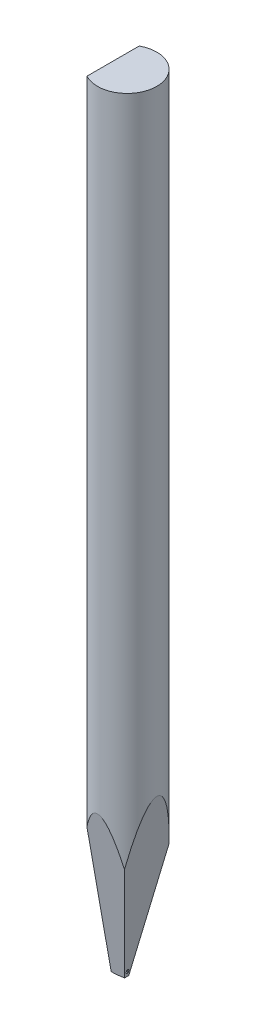
ISO-10303-21;
HEADER;
FILE_DESCRIPTION(('STEP AP214'),'2;1');
FILE_NAME('part.step','',(''),(''),'','','');
FILE_SCHEMA(('AUTOMOTIVE_DESIGN { 1 0 10303 214 1 1 1 1 }'));
ENDSEC;
DATA;
#1=APPLICATION_CONTEXT('core data for automotive mechanical design processes');
#2=APPLICATION_PROTOCOL_DEFINITION('international standard','automotive_design',2000,#1);
#3=PRODUCT_CONTEXT('',#1,'mechanical');
#4=PRODUCT('Part','Part','',(#3));
#5=PRODUCT_RELATED_PRODUCT_CATEGORY('part','',(#4));
#6=PRODUCT_DEFINITION_FORMATION('','',#4);
#7=PRODUCT_DEFINITION_CONTEXT('part definition',#1,'design');
#8=PRODUCT_DEFINITION('design','',#6,#7);
#9=PRODUCT_DEFINITION_SHAPE('','',#8);
#10=(LENGTH_UNIT() NAMED_UNIT(*) SI_UNIT(.MILLI.,.METRE.));
#11=(NAMED_UNIT(*) PLANE_ANGLE_UNIT() SI_UNIT($,.RADIAN.));
#12=(NAMED_UNIT(*) SI_UNIT($,.STERADIAN.) SOLID_ANGLE_UNIT());
#13=UNCERTAINTY_MEASURE_WITH_UNIT(LENGTH_MEASURE(1.E-05),#10,'distance_accuracy_value','');
#14=(GEOMETRIC_REPRESENTATION_CONTEXT(3) GLOBAL_UNCERTAINTY_ASSIGNED_CONTEXT((#13)) GLOBAL_UNIT_ASSIGNED_CONTEXT((#10,
#11,#12)) REPRESENTATION_CONTEXT('',''));
#15=CARTESIAN_POINT('',(0.,0.,0.));
#16=DIRECTION('',(0.,0.,1.));
#17=DIRECTION('',(1.,0.,0.));
#18=AXIS2_PLACEMENT_3D('',#15,#16,#17);
#19=CARTESIAN_POINT('',(-0.27432,0.,27.2760283406468));
#20=DIRECTION('',(-0.139173100960066,0.99026806874157,0.));
#21=DIRECTION('',(-0.99026806874157,-0.139173100960066,0.));
#22=AXIS2_PLACEMENT_3D('',#19,#20,#21);
#23=PLANE('',#22);
#24=DIRECTION('',(-0.99026806874157,-0.139173100960066,0.));
#25=VECTOR('',#24,1.);
#26=CARTESIAN_POINT('',(-0.27432,0.,0.0253999999999983));
#27=LINE('',#26,#25);
#28=CARTESIAN_POINT('',(-0.145800064,0.018062299081338,0.0253999999999992));
#29=VERTEX_POINT('',#28);
#30=CARTESIAN_POINT('',(-0.254691435266474,0.00275861487165983,0.0254));
#31=VERTEX_POINT('',#30);
#32=EDGE_CURVE('E186',#29,#31,#27,.T.);
#33=ORIENTED_EDGE('',*,*,#32,.F.);
#34=DIRECTION('',(0.,0.,1.));
#35=VECTOR('',#34,1.);
#36=CARTESIAN_POINT('',(-0.145800064,0.018062299081338,27.2760283406468));
#37=LINE('',#36,#35);
#38=CARTESIAN_POINT('',(-0.145800064,0.018062299081338,-0.0253999999999992));
#39=VERTEX_POINT('',#38);
#40=EDGE_CURVE('E11',#39,#29,#37,.T.);
#41=ORIENTED_EDGE('',*,*,#40,.F.);
#42=DIRECTION('',(-0.99026806874157,-0.139173100960066,0.));
#43=VECTOR('',#42,1.);
#44=CARTESIAN_POINT('',(-0.27432,0.,-0.0253999999999983));
#45=LINE('',#44,#43);
#46=CARTESIAN_POINT('',(-0.254691435266474,0.00275861487165983,-0.0254));
#47=VERTEX_POINT('',#46);
#48=EDGE_CURVE('E183',#39,#47,#45,.T.);
#49=ORIENTED_EDGE('',*,*,#48,.T.);
#50=CARTESIAN_POINT('',(-2.43404817183527,-0.30353,0.));
#51=DIRECTION('',(-0.139173100960066,0.99026806874157,0.));
#52=DIRECTION('',(-0.99026806874157,-0.139173100960066,0.));
#53=AXIS2_PLACEMENT_3D('',#50,#51,#52);
#54=ELLIPSE('',#53,2.20832903686027,0.30734);
#55=CARTESIAN_POINT('',(-0.274320000000002,0.,-0.0482432865795852));
#56=VERTEX_POINT('',#55);
#57=EDGE_CURVE('E192',#47,#56,#54,.T.);
#58=ORIENTED_EDGE('',*,*,#57,.T.);
#59=DIRECTION('',(0.,0.,-1.));
#60=VECTOR('',#59,1.);
#61=CARTESIAN_POINT('',(-0.27432,0.,27.2760283406468));
#62=LINE('',#61,#60);
#63=CARTESIAN_POINT('',(-0.274319999999996,0.,-0.0508000000000001));
#64=VERTEX_POINT('',#63);
#65=EDGE_CURVE('E210',#56,#64,#62,.T.);
#66=ORIENTED_EDGE('',*,*,#65,.T.);
#67=DIRECTION('',(0.98997002855162,0.139131214142995,-0.0245325869121374));
#68=VECTOR('',#67,1.);
#69=CARTESIAN_POINT('',(26.3320118858664,3.73927609160853,-0.710135263268685));
#70=LINE('',#69,#68);
#71=CARTESIAN_POINT('',(-0.0138656438636779,0.0366044726132731,-0.0572543561363243));
#72=VERTEX_POINT('',#71);
#73=EDGE_CURVE('E252',#64,#72,#70,.T.);
#74=ORIENTED_EDGE('',*,*,#73,.T.);
#75=DIRECTION('',(0.,0.,-1.));
#76=VECTOR('',#75,1.);
#77=CARTESIAN_POINT('',(-0.0138656438636759,0.036604472613273,27.2760283406468));
#78=LINE('',#77,#76);
#79=CARTESIAN_POINT('',(-0.0138656438636779,0.0366044726132731,0.0572543561363243));
#80=VERTEX_POINT('',#79);
#81=EDGE_CURVE('E207',#80,#72,#78,.T.);
#82=ORIENTED_EDGE('',*,*,#81,.F.);
#83=DIRECTION('',(-0.98997002855162,-0.139131214142995,-0.0245325869121374));
#84=VECTOR('',#83,1.);
#85=CARTESIAN_POINT('',(26.3320118858664,3.73927609160853,0.710135263268685));
#86=LINE('',#85,#84);
#87=CARTESIAN_POINT('',(-0.274319999999996,0.,0.0508000000000001));
#88=VERTEX_POINT('',#87);
#89=EDGE_CURVE('E220',#80,#88,#86,.T.);
#90=ORIENTED_EDGE('',*,*,#89,.T.);
#91=CARTESIAN_POINT('',(-0.274320000000002,0.,0.0482432865795852));
#92=VERTEX_POINT('',#91);
#93=EDGE_CURVE('E211',#88,#92,#62,.T.);
#94=ORIENTED_EDGE('',*,*,#93,.T.);
#95=EDGE_CURVE('E194',#92,#31,#54,.T.);
#96=ORIENTED_EDGE('',*,*,#95,.T.);
#97=EDGE_LOOP('',(#33,#41,#49,#58,#66,#74,#82,#90,#94,#96));
#98=FACE_BOUND('',#97,.T.);
#99=ADVANCED_FACE('F43',(#98),#23,.F.);
#100=CARTESIAN_POINT('',(26.8421219491216,-0.30353,0.));
#101=DIRECTION('',(-1.,0.,0.));
#102=DIRECTION('',(0.,0.,1.));
#103=AXIS2_PLACEMENT_3D('',#100,#101,#102);
#104=CYLINDRICAL_SURFACE('',#103,0.30734);
#105=DIRECTION('',(-1.,0.,0.));
#106=VECTOR('',#105,1.);
#107=CARTESIAN_POINT('',(26.8421219491216,0.00275861487165983,0.0254));
#108=LINE('',#107,#106);
#109=CARTESIAN_POINT('',(-0.277017052873613,0.0027586148716614,0.0254));
#110=VERTEX_POINT('',#109);
#111=EDGE_CURVE('E51',#31,#110,#108,.T.);
#112=ORIENTED_EDGE('',*,*,#111,.F.);
#113=ORIENTED_EDGE('',*,*,#95,.F.);
#114=DIRECTION('',(-1.,0.,0.));
#115=VECTOR('',#114,1.);
#116=CARTESIAN_POINT('',(26.8421219491216,0.,0.0482432865795852));
#117=LINE('',#116,#115);
#118=CARTESIAN_POINT('',(-0.35052,0.,0.0482432865795794));
#119=VERTEX_POINT('',#118);
#120=EDGE_CURVE('E66',#92,#119,#117,.T.);
#121=ORIENTED_EDGE('',*,*,#120,.T.);
#122=CARTESIAN_POINT('',(-0.35052,0.,-0.0482432865795922));
#123=CARTESIAN_POINT('',(-0.350767913301095,-1.1954284377854E-07,-0.048243986655547));
#124=CARTESIAN_POINT('',(-0.351014861392933,3.62470794983104E-06,-0.048220483758382));
#125=CARTESIAN_POINT('',(-0.351497824475881,1.77257610530524E-05,-0.0481316635507885));
#126=CARTESIAN_POINT('',(-0.351733938449228,2.79980345508149E-05,-0.0480668807295797));
#127=CARTESIAN_POINT('',(-0.352256326088675,5.7700596975821E-05,-0.0478789541586123));
#128=CARTESIAN_POINT('',(-0.352538394385228,7.88787351782363E-05,-0.047744619946916));
#129=CARTESIAN_POINT('',(-0.353078295346922,0.000127703558985957,-0.0474331108524054));
#130=CARTESIAN_POINT('',(-0.353335984553504,0.000155385552449555,-0.0472557019452803));
#131=CARTESIAN_POINT('',(-0.35400174233734,0.000236174594357564,-0.0467343071530911));
#132=CARTESIAN_POINT('',(-0.354386489991853,0.000293366747035748,-0.04636155839518));
#133=CARTESIAN_POINT('',(-0.355098951579075,0.000413574680164979,-0.0455669319559005));
#134=CARTESIAN_POINT('',(-0.355426537167256,0.000476603091413922,-0.0451449471799635));
#135=CARTESIAN_POINT('',(-0.356612086855197,0.000724574718518985,-0.0434579803018282));
#136=CARTESIAN_POINT('',(-0.357318341338529,0.000917424822642262,-0.0420900984298431));
#137=CARTESIAN_POINT('',(-0.358546499103956,0.00129385703696158,-0.0392733364497363));
#138=CARTESIAN_POINT('',(-0.359067131306758,0.00147736813627271,-0.0378239736930998));
#139=CARTESIAN_POINT('',(-0.361082963556257,0.00223677886764565,-0.0314441024489371));
#140=CARTESIAN_POINT('',(-0.361998491462296,0.00272303861932417,-0.0263250556700667));
#141=CARTESIAN_POINT('',(-0.363287466260709,0.00343648568054139,-0.0160225561821167));
#142=CARTESIAN_POINT('',(-0.363659578270333,0.00366303472730859,-0.0108389763128923));
#143=CARTESIAN_POINT('',(-0.363972985043323,0.0038533013861436,-0.000449493392455334));
#144=CARTESIAN_POINT('',(-0.363914353724791,0.00381706409391488,0.0047564056754146));
#145=CARTESIAN_POINT('',(-0.363359645903478,0.00348101396992449,0.0151346555748685));
#146=CARTESIAN_POINT('',(-0.362863906204432,0.00318140407435992,0.0203070291482927));
#147=CARTESIAN_POINT('',(-0.361587863461912,0.00253284401461593,0.0281196828661384));
#148=CARTESIAN_POINT('',(-0.361052170464872,0.00227386598671672,0.0308032472057591));
#149=CARTESIAN_POINT('',(-0.359879874536833,0.00178202258087566,0.035298540975975));
#150=CARTESIAN_POINT('',(-0.359320212463204,0.00156415994286525,0.037132976562585));
#151=CARTESIAN_POINT('',(-0.357915449615094,0.00108653420359277,0.0408693960879644));
#152=CARTESIAN_POINT('',(-0.357051905851088,0.000824845821214569,0.0427659366927868));
#153=CARTESIAN_POINT('',(-0.355666955135468,0.000526022910361374,0.0448100132221754));
#154=CARTESIAN_POINT('',(-0.355427139387405,0.000477218188451427,0.0451397061499284));
#155=CARTESIAN_POINT('',(-0.354916645564496,0.000382020953423657,0.0457761949331294));
#156=CARTESIAN_POINT('',(-0.35464590420184,0.00033563368038394,0.0460829416292439));
#157=CARTESIAN_POINT('',(-0.354064289185938,0.000246758191852077,0.0466652445212367));
#158=CARTESIAN_POINT('',(-0.353752942125968,0.000204328109507224,0.046940346423817));
#159=CARTESIAN_POINT('',(-0.353086480397466,0.000127793869629602,0.0474329155161212));
#160=CARTESIAN_POINT('',(-0.352731561443883,9.36543940548731E-05,0.0476506275388511));
#161=CARTESIAN_POINT('',(-0.352132978988947,5.02841505668838E-05,0.0479259603811172));
#162=CARTESIAN_POINT('',(-0.351903112512633,3.65754200280905E-05,0.0480126464944076));
#163=CARTESIAN_POINT('',(-0.351432234922693,1.53075235903079E-05,0.0481469291864223));
#164=CARTESIAN_POINT('',(-0.351191258260091,7.73054276190169E-06,0.0481946390090961));
#165=CARTESIAN_POINT('',(-0.350805892270718,1.19685939589671E-06,0.0482357533750448));
#166=CARTESIAN_POINT('',(-0.350662956582401,-3.31045745124852E-08,0.04824348277755));
#167=CARTESIAN_POINT('',(-0.350520000000001,0.,0.0482432865795857));
#168=B_SPLINE_CURVE_WITH_KNOTS('',3,(#122,#123,#124,#125,#126,#127,#128,#129,#130,#131,#132,
#133,#134,#135,#136,#137,#138,#139,#140,#141,#142,#143,#144,#145,#146,#147,#148,#149,#150,#151,
#152,#153,#154,#155,#156,#157,#158,#159,#160,#161,#162,#163,#164,#165,#166,#167),.UNSPECIFIED.,
.F.,.F.,(4,2,2,2,2,2,2,2,2,2,2,2,2,2,2,2,2,2,2,2,2,2,4),(0.,0.000741043318305509,
0.00147268140779471,0.00240682725086905,0.00334616655925005,0.00495326023235513,
0.00656391709747349,0.0111818210056003,0.0158307654682399,0.0313880221471919,0.0469834307890319,
0.0625761632290504,0.0781568915394562,0.0863865542979414,0.0921775559521106,0.0984081610415071,
0.0996385359492031,0.100871475463097,0.102120347956795,0.103363803055086,0.10409917629346,
0.104832405260402,0.105261095012052),.UNSPECIFIED.);
#169=CARTESIAN_POINT('',(-0.350519999999986,0.,-0.0482432865795852));
#170=VERTEX_POINT('',#169);
#171=EDGE_CURVE('E258',#170,#119,#168,.T.);
#172=ORIENTED_EDGE('',*,*,#171,.F.);
#173=DIRECTION('',(-1.,0.,0.));
#174=VECTOR('',#173,1.);
#175=CARTESIAN_POINT('',(26.8421219491216,0.,-0.0482432865795852));
#176=LINE('',#175,#174);
#177=EDGE_CURVE('E189',#56,#170,#176,.T.);
#178=ORIENTED_EDGE('',*,*,#177,.F.);
#179=ORIENTED_EDGE('',*,*,#57,.F.);
#180=DIRECTION('',(-1.,0.,0.));
#181=VECTOR('',#180,1.);
#182=CARTESIAN_POINT('',(26.8421219491216,0.00275861487165983,-0.0254));
#183=LINE('',#182,#181);
#184=CARTESIAN_POINT('',(-0.277017052873613,0.00275861487166104,-0.0254));
#185=VERTEX_POINT('',#184);
#186=EDGE_CURVE('E266',#47,#185,#183,.T.);
#187=ORIENTED_EDGE('',*,*,#186,.T.);
#188=CARTESIAN_POINT('',(-0.277017052873616,0.00275861487166319,-0.0254));
#189=CARTESIAN_POINT('',(-0.279164494405987,0.00275787671528144,-0.0253998771308303));
#190=CARTESIAN_POINT('',(-0.281317796028356,0.0027729853064504,-0.025226095347651));
#191=CARTESIAN_POINT('',(-0.285576223600568,0.00283121514116092,-0.0245140453953915));
#192=CARTESIAN_POINT('',(-0.287680955965897,0.00287451396608212,-0.0239734657049869));
#193=CARTESIAN_POINT('',(-0.291341514558487,0.00297415080728849,-0.0226581646183284));
#194=CARTESIAN_POINT('',(-0.292922287395721,0.00302608298732995,-0.021952874053652));
#195=CARTESIAN_POINT('',(-0.295944343791115,0.00314031874074114,-0.02029499673845));
#196=CARTESIAN_POINT('',(-0.297386025451601,0.00320259123656538,-0.019343146355838));
#197=CARTESIAN_POINT('',(-0.299856415426539,0.00332011935603143,-0.0173691432443147));
#198=CARTESIAN_POINT('',(-0.300914183310512,0.00337487582877375,-0.0163834060277842));
#199=CARTESIAN_POINT('',(-0.302853499386786,0.00348134304003134,-0.0142495600312396));
#200=CARTESIAN_POINT('',(-0.303735025277574,0.0035330533925099,-0.0131014307336146));
#201=CARTESIAN_POINT('',(-0.305284096014948,0.00362763657878566,-0.0106566504876344));
#202=CARTESIAN_POINT('',(-0.305950195024492,0.00367044903655595,-0.00935907216897071));
#203=CARTESIAN_POINT('',(-0.307020092293608,0.0037407949631982,-0.00665943953193492));
#204=CARTESIAN_POINT('',(-0.307424109068022,0.00376834115773853,-0.00525747333863388));
#205=CARTESIAN_POINT('',(-0.307911272474051,0.00380177700804997,-0.00257512047658988));
#206=CARTESIAN_POINT('',(-0.308027491080704,0.00380989467913993,-0.00130070779819402));
#207=CARTESIAN_POINT('',(-0.308030522738467,0.00381010307647606,0.00124816111540462));
#208=CARTESIAN_POINT('',(-0.307917423652917,0.00380219994111312,0.00252261714690251));
#209=CARTESIAN_POINT('',(-0.307481391057916,0.00377227202854999,0.00495889317186652));
#210=CARTESIAN_POINT('',(-0.30717085992914,0.00375108287767712,0.00612298167055997));
#211=CARTESIAN_POINT('',(-0.306366851611119,0.00369766813586477,0.00838554438941712));
#212=CARTESIAN_POINT('',(-0.305873360574227,0.0036654417095634,0.00948401363576132));
#213=CARTESIAN_POINT('',(-0.304700004775482,0.00359159572869644,0.0116366413861182));
#214=CARTESIAN_POINT('',(-0.304013120069097,0.00354963561612969,0.0126869416901592));
#215=CARTESIAN_POINT('',(-0.3024904948519,0.00346116467833486,0.0146727846946996));
#216=CARTESIAN_POINT('',(-0.301654697065106,0.00341465210522104,0.0156082830046177));
#217=CARTESIAN_POINT('',(-0.29975438753179,0.00331531896242703,0.0174580910740626));
#218=CARTESIAN_POINT('',(-0.298674483418413,0.00326240821162122,0.0183565395392823));
#219=CARTESIAN_POINT('',(-0.296397739190382,0.00316031129225176,0.0199899762242422));
#220=CARTESIAN_POINT('',(-0.295200842340051,0.00311112695154108,0.0207248845634118));
#221=CARTESIAN_POINT('',(-0.292512645688036,0.00301243060223673,0.0221404867419709));
#222=CARTESIAN_POINT('',(-0.291005645151681,0.00296424837308397,0.0227913928023832));
#223=CARTESIAN_POINT('',(-0.287914241115431,0.00288175486882889,0.0238748004063651));
#224=CARTESIAN_POINT('',(-0.286329773788391,0.00284745525547328,0.0243071184061138));
#225=CARTESIAN_POINT('',(-0.283455003528155,0.00280047332263064,0.0248914653993345));
#226=CARTESIAN_POINT('',(-0.282172577348956,0.00278476835336049,0.0250832300682597));
#227=CARTESIAN_POINT('',(-0.279599022116572,0.00276381915932513,0.0253372121777126));
#228=CARTESIAN_POINT('',(-0.278307935042222,0.00275854101258006,0.0253998497414433));
#229=CARTESIAN_POINT('',(-0.277017052875003,0.00275861487110465,0.0254000000067783));
#230=B_SPLINE_CURVE_WITH_KNOTS('',3,(#188,#189,#190,#191,#192,#193,#194,#195,#196,#197,#198,
#199,#200,#201,#202,#203,#204,#205,#206,#207,#208,#209,#210,#211,#212,#213,#214,#215,#216,#217,
#218,#219,#220,#221,#222,#223,#224,#225,#226,#227,#228,#229),.UNSPECIFIED.,.F.,.F.,(4,2,2,2,2,2,
2,2,2,2,2,2,2,2,2,2,2,2,2,2,4),(0.,0.006445082799109,0.0129311637490577,0.0181059616421331,
0.0232654793449091,0.0275885263307982,0.0319121200056629,0.0362641566953628,0.0406125601319723,
0.0444316470545822,0.0482492709661115,0.0518480159838001,0.0554470334345727,0.0591987706886129,
0.0629519540893279,0.067153184421551,0.0713564623468411,0.07626502081946,0.0811776940895098,
0.0850616737339214,0.088932996532078),.UNSPECIFIED.);
#231=EDGE_CURVE('E281',#185,#110,#230,.T.);
#232=ORIENTED_EDGE('',*,*,#231,.T.);
#233=EDGE_LOOP('',(#112,#113,#121,#172,#178,#179,#187,#232));
#234=FACE_BOUND('',#233,.T.);
#235=ADVANCED_FACE('F271',(#234),#104,.F.);
#236=CARTESIAN_POINT('',(0.,0.,0.));
#237=DIRECTION('',(0.,1.,0.));
#238=DIRECTION('',(0.,0.,1.));
#239=AXIS2_PLACEMENT_3D('',#236,#237,#238);
#240=PLANE('',#239);
#241=ORIENTED_EDGE('',*,*,#120,.F.);
#242=ORIENTED_EDGE('',*,*,#93,.F.);
#243=DIRECTION('',(-1.,0.,0.));
#244=VECTOR('',#243,1.);
#245=CARTESIAN_POINT('',(26.8738719491216,0.,0.0508));
#246=LINE('',#245,#244);
#247=CARTESIAN_POINT('',(-0.35052,0.,0.0507999999999983));
#248=VERTEX_POINT('',#247);
#249=EDGE_CURVE('E223',#88,#248,#246,.T.);
#250=ORIENTED_EDGE('',*,*,#249,.T.);
#251=DIRECTION('',(0.,0.,-1.));
#252=VECTOR('',#251,1.);
#253=CARTESIAN_POINT('',(-0.35052,0.,26.4674719491216));
#254=LINE('',#253,#252);
#255=EDGE_CURVE('E198',#248,#119,#254,.T.);
#256=ORIENTED_EDGE('',*,*,#255,.T.);
#257=EDGE_LOOP('',(#241,#242,#250,#256));
#258=FACE_BOUND('',#257,.T.);
#259=ADVANCED_FACE('F275',(#258),#240,.F.);
#260=CARTESIAN_POINT('',(26.8738719491216,0.,0.0508));
#261=DIRECTION('',(0.,-0.173648177666931,0.984807753012208));
#262=DIRECTION('',(0.,-0.984807753012208,-0.173648177666931));
#263=AXIS2_PLACEMENT_3D('',#260,#261,#262);
#264=PLANE('',#263);
#265=CARTESIAN_POINT('',(-0.35052,0.0254,0.0552787053099933));
#266=DIRECTION('',(0.,-0.173648177666931,0.984807753012208));
#267=DIRECTION('',(0.,-0.984807753012208,-0.173648177666931));
#268=AXIS2_PLACEMENT_3D('',#265,#266,#267);
#269=ELLIPSE('',#268,0.0257918359418979,0.0254);
#270=CARTESIAN_POINT('',(-0.37592,0.0254,0.0552787053099933));
#271=VERTEX_POINT('',#270);
#272=EDGE_CURVE('E201',#248,#271,#269,.F.);
#273=ORIENTED_EDGE('',*,*,#272,.F.);
#274=ORIENTED_EDGE('',*,*,#249,.F.);
#275=ORIENTED_EDGE('',*,*,#89,.F.);
#276=DIRECTION('',(-0.171087869746036,-0.970287525247814,-0.171087869746036));
#277=VECTOR('',#276,1.);
#278=CARTESIAN_POINT('',(0.766901483986011,4.46455489014234,0.838021483986017));
#279=LINE('',#278,#277);
#280=CARTESIAN_POINT('',(0.523678555180163,3.08516911589156,0.594798555180167));
#281=VERTEX_POINT('',#280);
#282=EDGE_CURVE('E217',#281,#80,#279,.T.);
#283=ORIENTED_EDGE('',*,*,#282,.F.);
#284=CARTESIAN_POINT('',(0.,-0.288101116436578,0.));
#285=DIRECTION('',(0.,-0.173648177666931,0.984807753012208));
#286=DIRECTION('',(0.,-0.984807753012208,-0.173648177666931));
#287=AXIS2_PLACEMENT_3D('',#284,#285,#286);
#288=ELLIPSE('',#287,4.56371043248163,0.792479999999998);
#289=CARTESIAN_POINT('',(-0.37592,3.66844093071414,0.69764511322018));
#290=VERTEX_POINT('',#289);
#291=EDGE_CURVE('E229',#281,#290,#288,.T.);
#292=ORIENTED_EDGE('',*,*,#291,.T.);
#293=DIRECTION('',(0.,0.984807753012208,0.173648177666931));
#294=VECTOR('',#293,1.);
#295=CARTESIAN_POINT('',(-0.37592,20.2093857917021,3.6142599786234));
#296=LINE('',#295,#294);
#297=EDGE_CURVE('E244',#271,#290,#296,.T.);
#298=ORIENTED_EDGE('',*,*,#297,.F.);
#299=EDGE_LOOP('',(#273,#274,#275,#283,#292,#298));
#300=FACE_BOUND('',#299,.T.);
#301=ADVANCED_FACE('F307',(#300),#264,.T.);
#302=CARTESIAN_POINT('',(26.8738719491216,0.,-0.0508));
#303=DIRECTION('',(0.,-0.173648177666931,-0.984807753012208));
#304=DIRECTION('',(0.,0.984807753012208,-0.173648177666931));
#305=AXIS2_PLACEMENT_3D('',#302,#303,#304);
#306=PLANE('',#305);
#307=CARTESIAN_POINT('',(-0.35052,0.0254,-0.0552787053099933));
#308=DIRECTION('',(0.,-0.173648177666931,-0.984807753012208));
#309=DIRECTION('',(0.,0.984807753012208,-0.173648177666931));
#310=AXIS2_PLACEMENT_3D('',#307,#308,#309);
#311=ELLIPSE('',#310,0.0257918359418979,0.0254);
#312=CARTESIAN_POINT('',(-0.37592,0.0254,-0.0552787053099933));
#313=VERTEX_POINT('',#312);
#314=CARTESIAN_POINT('',(-0.35052,0.,-0.0508000000000002));
#315=VERTEX_POINT('',#314);
#316=EDGE_CURVE('E255',#313,#315,#311,.F.);
#317=ORIENTED_EDGE('',*,*,#316,.F.);
#318=DIRECTION('',(0.,-0.984807753012208,0.173648177666931));
#319=VECTOR('',#318,1.);
#320=CARTESIAN_POINT('',(-0.37592,20.5673030312895,-3.67737044482337));
#321=LINE('',#320,#319);
#322=CARTESIAN_POINT('',(-0.37592,3.66844093071414,-0.69764511322018));
#323=VERTEX_POINT('',#322);
#324=EDGE_CURVE('E246',#323,#313,#321,.T.);
#325=ORIENTED_EDGE('',*,*,#324,.F.);
#326=CARTESIAN_POINT('',(0.,-0.288101116436578,0.));
#327=DIRECTION('',(0.,-0.173648177666931,-0.984807753012208));
#328=DIRECTION('',(0.,-0.984807753012208,0.173648177666931));
#329=AXIS2_PLACEMENT_3D('',#326,#327,#328);
#330=ELLIPSE('',#329,4.56371043248163,0.792479999999998);
#331=CARTESIAN_POINT('',(0.523678555180163,3.08516911589156,-0.594798555180167));
#332=VERTEX_POINT('',#331);
#333=EDGE_CURVE('E232',#323,#332,#330,.T.);
#334=ORIENTED_EDGE('',*,*,#333,.T.);
#335=DIRECTION('',(0.171087869746036,0.970287525247814,-0.171087869746036));
#336=VECTOR('',#335,1.);
#337=CARTESIAN_POINT('',(0.766901483986011,4.46455489014234,-0.838021483986017));
#338=LINE('',#337,#336);
#339=EDGE_CURVE('E249',#72,#332,#338,.T.);
#340=ORIENTED_EDGE('',*,*,#339,.F.);
#341=ORIENTED_EDGE('',*,*,#73,.F.);
#342=DIRECTION('',(-1.,0.,0.));
#343=VECTOR('',#342,1.);
#344=CARTESIAN_POINT('',(26.8738719491216,0.,-0.0508));
#345=LINE('',#344,#343);
#346=EDGE_CURVE('E226',#64,#315,#345,.T.);
#347=ORIENTED_EDGE('',*,*,#346,.T.);
#348=EDGE_LOOP('',(#317,#325,#334,#340,#341,#347));
#349=FACE_BOUND('',#348,.T.);
#350=ADVANCED_FACE('F315',(#349),#306,.T.);
#351=ORIENTED_EDGE('',*,*,#65,.F.);
#352=ORIENTED_EDGE('',*,*,#177,.T.);
#353=EDGE_CURVE('E202',#170,#315,#254,.T.);
#354=ORIENTED_EDGE('',*,*,#353,.T.);
#355=ORIENTED_EDGE('',*,*,#346,.F.);
#356=EDGE_LOOP('',(#351,#352,#354,#355));
#357=FACE_BOUND('',#356,.T.);
#358=ADVANCED_FACE('F317',(#357),#240,.F.);
#359=CARTESIAN_POINT('',(0.,21.0312,0.));
#360=DIRECTION('',(0.,-1.,0.));
#361=DIRECTION('',(0.,0.,-1.));
#362=AXIS2_PLACEMENT_3D('',#359,#360,#361);
#363=CYLINDRICAL_SURFACE('',#362,0.792479999999998);
#364=ORIENTED_EDGE('',*,*,#291,.F.);
#365=CARTESIAN_POINT('',(0.,0.115240446574634,0.));
#366=DIRECTION('',(-0.984807753012208,0.173648177666931,0.));
#367=DIRECTION('',(-0.173648177666931,-0.984807753012208,0.));
#368=AXIS2_PLACEMENT_3D('',#365,#366,#367);
#369=ELLIPSE('',#368,4.56371043248165,0.792479999999998);
#370=EDGE_CURVE('E214',#281,#332,#369,.T.);
#371=ORIENTED_EDGE('',*,*,#370,.T.);
#372=ORIENTED_EDGE('',*,*,#333,.F.);
#373=DIRECTION('',(0.,-1.,0.));
#374=VECTOR('',#373,1.);
#375=CARTESIAN_POINT('',(-0.37592,21.0312,-0.69764511322018));
#376=LINE('',#375,#374);
#377=CARTESIAN_POINT('',(-0.37592,21.0312,-0.69764511322018));
#378=VERTEX_POINT('',#377);
#379=EDGE_CURVE('E238',#378,#323,#376,.T.);
#380=ORIENTED_EDGE('',*,*,#379,.F.);
#381=CARTESIAN_POINT('',(0.,21.0312,0.));
#382=DIRECTION('',(0.,1.,0.));
#383=DIRECTION('',(0.,0.,1.));
#384=AXIS2_PLACEMENT_3D('',#381,#382,#383);
#385=CIRCLE('',#384,0.792479999999998);
#386=CARTESIAN_POINT('',(-0.37592,21.0312,0.69764511322018));
#387=VERTEX_POINT('',#386);
#388=EDGE_CURVE('E241',#387,#378,#385,.T.);
#389=ORIENTED_EDGE('',*,*,#388,.F.);
#390=DIRECTION('',(0.,-1.,0.));
#391=VECTOR('',#390,1.);
#392=CARTESIAN_POINT('',(-0.37592,21.0312,0.69764511322018));
#393=LINE('',#392,#391);
#394=EDGE_CURVE('E236',#290,#387,#393,.F.);
#395=ORIENTED_EDGE('',*,*,#394,.F.);
#396=EDGE_LOOP('',(#364,#371,#372,#380,#389,#395));
#397=FACE_BOUND('',#396,.T.);
#398=ADVANCED_FACE('F45',(#397),#363,.T.);
#399=CARTESIAN_POINT('',(-0.37592,21.0312,-1.04648));
#400=DIRECTION('',(-1.,0.,0.));
#401=DIRECTION('',(0.,0.,1.));
#402=AXIS2_PLACEMENT_3D('',#399,#400,#401);
#403=PLANE('',#402);
#404=DIRECTION('',(0.,0.,-1.));
#405=VECTOR('',#404,1.);
#406=CARTESIAN_POINT('',(-0.37592,0.0254,26.4674719491216));
#407=LINE('',#406,#405);
#408=EDGE_CURVE('E197',#271,#313,#407,.T.);
#409=ORIENTED_EDGE('',*,*,#408,.F.);
#410=ORIENTED_EDGE('',*,*,#297,.T.);
#411=ORIENTED_EDGE('',*,*,#394,.T.);
#412=DIRECTION('',(0.,0.,-1.));
#413=VECTOR('',#412,1.);
#414=CARTESIAN_POINT('',(-0.37592,21.0312,-1.04648));
#415=LINE('',#414,#413);
#416=EDGE_CURVE('E234',#387,#378,#415,.T.);
#417=ORIENTED_EDGE('',*,*,#416,.T.);
#418=ORIENTED_EDGE('',*,*,#379,.T.);
#419=ORIENTED_EDGE('',*,*,#324,.T.);
#420=EDGE_LOOP('',(#409,#410,#411,#417,#418,#419));
#421=FACE_BOUND('',#420,.T.);
#422=ADVANCED_FACE('F323',(#421),#403,.T.);
#423=CARTESIAN_POINT('',(0.,21.0312,0.));
#424=DIRECTION('',(0.,1.,0.));
#425=DIRECTION('',(0.,0.,1.));
#426=AXIS2_PLACEMENT_3D('',#423,#424,#425);
#427=PLANE('',#426);
#428=ORIENTED_EDGE('',*,*,#388,.T.);
#429=ORIENTED_EDGE('',*,*,#416,.F.);
#430=EDGE_LOOP('',(#428,#429));
#431=FACE_BOUND('',#430,.T.);
#432=ADVANCED_FACE('F296',(#431),#427,.T.);
#433=CARTESIAN_POINT('',(-0.0138656438636759,0.036604472613273,27.2760283406468));
#434=DIRECTION('',(-0.984807753012208,0.173648177666931,0.));
#435=DIRECTION('',(-0.173648177666931,-0.984807753012208,0.));
#436=AXIS2_PLACEMENT_3D('',#433,#434,#435);
#437=PLANE('',#436);
#438=CARTESIAN_POINT('',(0.00997913420261824,0.171834928953466,0.));
#439=DIRECTION('',(-0.984807753012208,0.173648177666931,0.));
#440=DIRECTION('',(0.173648177666931,0.984807753012208,0.));
#441=AXIS2_PLACEMENT_3D('',#438,#439,#440);
#442=ELLIPSE('',#441,0.0515734368592615,0.0370444608655554);
#443=CARTESIAN_POINT('',(0.0189347675292495,0.222624849421952,0.));
#444=VERTEX_POINT('',#443);
#445=EDGE_CURVE('E188',#444,#444,#442,.F.);
#446=ORIENTED_EDGE('',*,*,#445,.F.);
#447=EDGE_LOOP('',(#446));
#448=FACE_BOUND('',#447,.T.);
#449=ORIENTED_EDGE('',*,*,#370,.F.);
#450=ORIENTED_EDGE('',*,*,#282,.T.);
#451=ORIENTED_EDGE('',*,*,#81,.T.);
#452=ORIENTED_EDGE('',*,*,#339,.T.);
#453=EDGE_LOOP('',(#449,#450,#451,#452));
#454=FACE_BOUND('',#453,.T.);
#455=ADVANCED_FACE('F293',(#448,#454),#437,.F.);
#456=CARTESIAN_POINT('',(-0.35052,0.0254,26.4674719491216));
#457=DIRECTION('',(0.,0.,-1.));
#458=DIRECTION('',(-1.,0.,0.));
#459=AXIS2_PLACEMENT_3D('',#456,#457,#458);
#460=CYLINDRICAL_SURFACE('',#459,0.0254);
#461=ORIENTED_EDGE('',*,*,#353,.F.);
#462=ORIENTED_EDGE('',*,*,#171,.T.);
#463=ORIENTED_EDGE('',*,*,#255,.F.);
#464=ORIENTED_EDGE('',*,*,#272,.T.);
#465=ORIENTED_EDGE('',*,*,#408,.T.);
#466=ORIENTED_EDGE('',*,*,#316,.T.);
#467=EDGE_LOOP('',(#461,#462,#463,#464,#465,#466));
#468=FACE_BOUND('',#467,.T.);
#469=ADVANCED_FACE('F268',(#468),#460,.T.);
#470=CARTESIAN_POINT('',(-0.145800064,0.0660400000000001,0.0254));
#471=DIRECTION('',(-1.,0.,0.));
#472=DIRECTION('',(0.,0.,1.));
#473=AXIS2_PLACEMENT_3D('',#470,#471,#472);
#474=PLANE('',#473);
#475=ORIENTED_EDGE('',*,*,#40,.T.);
#476=DIRECTION('',(0.,1.,0.));
#477=VECTOR('',#476,1.);
#478=CARTESIAN_POINT('',(-0.145800064,0.0660400000000001,0.0254));
#479=LINE('',#478,#477);
#480=CARTESIAN_POINT('',(-0.145800064,0.0660400000000001,0.0254));
#481=VERTEX_POINT('',#480);
#482=EDGE_CURVE('E169',#29,#481,#479,.T.);
#483=ORIENTED_EDGE('',*,*,#482,.T.);
#484=DIRECTION('',(0.,0.,-1.));
#485=VECTOR('',#484,1.);
#486=CARTESIAN_POINT('',(-0.145800064,0.0660400000000001,0.0254));
#487=LINE('',#486,#485);
#488=CARTESIAN_POINT('',(-0.145800064,0.0660400000000001,0.02286));
#489=VERTEX_POINT('',#488);
#490=EDGE_CURVE('E158',#481,#489,#487,.T.);
#491=ORIENTED_EDGE('',*,*,#490,.T.);
#492=CARTESIAN_POINT('',(-0.145800064,0.0660400000000001,0.));
#493=DIRECTION('',(-1.,0.,0.));
#494=DIRECTION('',(0.,1.,0.));
#495=AXIS2_PLACEMENT_3D('',#492,#493,#494);
#496=ELLIPSE('',#495,0.0263964543073496,0.02286);
#497=CARTESIAN_POINT('',(-0.145800064,0.0660400000000001,-0.02286));
#498=VERTEX_POINT('',#497);
#499=EDGE_CURVE('E150',#489,#498,#496,.F.);
#500=ORIENTED_EDGE('',*,*,#499,.T.);
#501=CARTESIAN_POINT('',(-0.145800064,0.0660400000000001,-0.0254));
#502=VERTEX_POINT('',#501);
#503=EDGE_CURVE('E155',#498,#502,#487,.T.);
#504=ORIENTED_EDGE('',*,*,#503,.T.);
#505=DIRECTION('',(0.,1.,0.));
#506=VECTOR('',#505,1.);
#507=CARTESIAN_POINT('',(-0.145800064,0.0660400000000001,-0.0254));
#508=LINE('',#507,#506);
#509=EDGE_CURVE('E176',#39,#502,#508,.T.);
#510=ORIENTED_EDGE('',*,*,#509,.F.);
#511=EDGE_LOOP('',(#475,#483,#491,#500,#504,#510));
#512=FACE_BOUND('',#511,.T.);
#513=ADVANCED_FACE('F152',(#512),#474,.T.);
#514=CARTESIAN_POINT('',(-0.0179613089676814,0.139847739630775,0.));
#515=DIRECTION('',(0.866025403784441,0.499999999999995,0.));
#516=DIRECTION('',(-0.499999999999995,0.866025403784441,0.));
#517=AXIS2_PLACEMENT_3D('',#514,#515,#516);
#518=CONICAL_SURFACE('',#517,0.02286,0.392699081698725);
#519=CARTESIAN_POINT('',(-0.0179613089676814,0.139847739630775,0.));
#520=DIRECTION('',(0.866025403784441,0.499999999999995,0.));
#521=DIRECTION('',(-0.499999999999995,0.866025403784441,0.));
#522=AXIS2_PLACEMENT_3D('',#519,#520,#521);
#523=CIRCLE('',#522,0.02286);
#524=CARTESIAN_POINT('',(-0.0293913089676813,0.159645080361287,0.));
#525=VERTEX_POINT('',#524);
#526=EDGE_CURVE('E165',#525,#525,#523,.T.);
#527=ORIENTED_EDGE('',*,*,#526,.F.);
#528=EDGE_LOOP('',(#527));
#529=FACE_BOUND('',#528,.T.);
#530=ORIENTED_EDGE('',*,*,#445,.T.);
#531=EDGE_LOOP('',(#530));
#532=FACE_BOUND('',#531,.T.);
#533=ADVANCED_FACE('F291',(#529,#532),#518,.F.);
#534=CARTESIAN_POINT('',(-0.229331108814043,0.0660400000000001,0.));
#535=DIRECTION('',(-0.601815023152052,-0.79863551004729,0.));
#536=DIRECTION('',(0.79863551004729,-0.601815023152052,0.));
#537=AXIS2_PLACEMENT_3D('',#534,#535,#536);
#538=CYLINDRICAL_SURFACE('',#537,0.0254);
#539=DIRECTION('',(0.601815023152052,0.79863551004729,0.));
#540=VECTOR('',#539,1.);
#541=CARTESIAN_POINT('',(-0.229331108814043,0.0660400000000001,-0.0254));
#542=LINE('',#541,#540);
#543=CARTESIAN_POINT('',(-0.229331108814043,0.0660400000000001,-0.0254));
#544=VERTEX_POINT('',#543);
#545=EDGE_CURVE('E58',#185,#544,#542,.T.);
#546=ORIENTED_EDGE('',*,*,#545,.T.);
#547=CARTESIAN_POINT('',(-0.229331108814043,0.0660400000000001,0.));
#548=DIRECTION('',(0.,-1.,0.));
#549=DIRECTION('',(-1.,0.,0.));
#550=AXIS2_PLACEMENT_3D('',#547,#548,#549);
#551=ELLIPSE('',#550,0.0318042457171683,0.0254);
#552=CARTESIAN_POINT('',(-0.229331108814043,0.0660400000000001,0.0254));
#553=VERTEX_POINT('',#552);
#554=EDGE_CURVE('E181',#544,#553,#551,.F.);
#555=ORIENTED_EDGE('',*,*,#554,.T.);
#556=DIRECTION('',(-0.601815023152052,-0.79863551004729,0.));
#557=VECTOR('',#556,1.);
#558=CARTESIAN_POINT('',(-0.178012525826945,0.134142059805924,0.0254));
#559=LINE('',#558,#557);
#560=EDGE_CURVE('E171',#553,#110,#559,.T.);
#561=ORIENTED_EDGE('',*,*,#560,.T.);
#562=ORIENTED_EDGE('',*,*,#231,.F.);
#563=EDGE_LOOP('',(#546,#555,#561,#562));
#564=FACE_BOUND('',#563,.T.);
#565=ADVANCED_FACE('F277',(#564),#538,.F.);
#566=CARTESIAN_POINT('',(0.,0.,0.0254));
#567=DIRECTION('',(0.,0.,-1.));
#568=DIRECTION('',(-1.,0.,0.));
#569=AXIS2_PLACEMENT_3D('',#566,#567,#568);
#570=PLANE('',#569);
#571=ORIENTED_EDGE('',*,*,#32,.T.);
#572=ORIENTED_EDGE('',*,*,#111,.T.);
#573=ORIENTED_EDGE('',*,*,#560,.F.);
#574=DIRECTION('',(-1.,0.,0.));
#575=VECTOR('',#574,1.);
#576=CARTESIAN_POINT('',(-0.261135354531211,0.0660400000000001,0.0254));
#577=LINE('',#576,#575);
#578=EDGE_CURVE('E172',#481,#553,#577,.T.);
#579=ORIENTED_EDGE('',*,*,#578,.F.);
#580=ORIENTED_EDGE('',*,*,#482,.F.);
#581=EDGE_LOOP('',(#571,#572,#573,#579,#580));
#582=FACE_BOUND('',#581,.T.);
#583=ADVANCED_FACE('F440',(#582),#570,.T.);
#584=CARTESIAN_POINT('',(0.,0.,-0.0254));
#585=DIRECTION('',(0.,0.,-1.));
#586=DIRECTION('',(-1.,0.,0.));
#587=AXIS2_PLACEMENT_3D('',#584,#585,#586);
#588=PLANE('',#587);
#589=ORIENTED_EDGE('',*,*,#509,.T.);
#590=DIRECTION('',(-1.,0.,0.));
#591=VECTOR('',#590,1.);
#592=CARTESIAN_POINT('',(-0.261135354531211,0.0660400000000001,-0.0254));
#593=LINE('',#592,#591);
#594=EDGE_CURVE('E160',#502,#544,#593,.T.);
#595=ORIENTED_EDGE('',*,*,#594,.T.);
#596=ORIENTED_EDGE('',*,*,#545,.F.);
#597=ORIENTED_EDGE('',*,*,#186,.F.);
#598=ORIENTED_EDGE('',*,*,#48,.F.);
#599=EDGE_LOOP('',(#589,#595,#596,#597,#598));
#600=FACE_BOUND('',#599,.T.);
#601=ADVANCED_FACE('F451',(#600),#588,.F.);
#602=CARTESIAN_POINT('',(-0.261135354531211,0.0660400000000001,0.0254));
#603=DIRECTION('',(0.,-1.,0.));
#604=DIRECTION('',(1.,0.,0.));
#605=AXIS2_PLACEMENT_3D('',#602,#603,#604);
#606=PLANE('',#605);
#607=ORIENTED_EDGE('',*,*,#594,.F.);
#608=ORIENTED_EDGE('',*,*,#503,.F.);
#609=CARTESIAN_POINT('',(-0.145800064,0.0660400000000001,0.));
#610=DIRECTION('',(0.,-1.,0.));
#611=DIRECTION('',(1.,0.,0.));
#612=AXIS2_PLACEMENT_3D('',#609,#610,#611);
#613=ELLIPSE('',#612,0.0457200000000004,0.02286);
#614=EDGE_CURVE('E161',#498,#489,#613,.F.);
#615=ORIENTED_EDGE('',*,*,#614,.T.);
#616=ORIENTED_EDGE('',*,*,#490,.F.);
#617=ORIENTED_EDGE('',*,*,#578,.T.);
#618=ORIENTED_EDGE('',*,*,#554,.F.);
#619=EDGE_LOOP('',(#607,#608,#615,#616,#617,#618));
#620=FACE_BOUND('',#619,.T.);
#621=ADVANCED_FACE('F167',(#620),#606,.T.);
#622=CARTESIAN_POINT('',(-0.299953273640532,-0.0229603970824046,0.));
#623=DIRECTION('',(0.866025403784441,0.499999999999995,0.));
#624=DIRECTION('',(-0.499999999999995,0.866025403784441,0.));
#625=AXIS2_PLACEMENT_3D('',#622,#623,#624);
#626=CYLINDRICAL_SURFACE('',#625,0.02286);
#627=ORIENTED_EDGE('',*,*,#526,.T.);
#628=EDGE_LOOP('',(#627));
#629=FACE_BOUND('',#628,.T.);
#630=ORIENTED_EDGE('',*,*,#614,.F.);
#631=ORIENTED_EDGE('',*,*,#499,.F.);
#632=EDGE_LOOP('',(#630,#631));
#633=FACE_BOUND('',#632,.T.);
#634=ADVANCED_FACE('F163',(#629,#633),#626,.F.);
#635=CLOSED_SHELL('',(#99,#235,#259,#301,#350,#358,#398,#422,#432,#455,#469,#513,#533,#565,#583,
#601,#621,#634));
#636=MANIFOLD_SOLID_BREP('B2',#635);
#637=ADVANCED_BREP_SHAPE_REPRESENTATION('',(#18,#636),#14);
#638=SHAPE_DEFINITION_REPRESENTATION(#9,#637);
ENDSEC;
END-ISO-10303-21;
